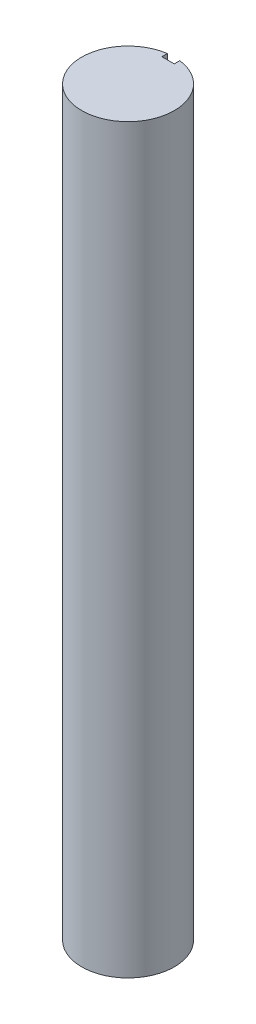
ISO-10303-21;
HEADER;
FILE_DESCRIPTION(('STEP AP214'),'2;1');
FILE_NAME('part.step','',(''),(''),'','','');
FILE_SCHEMA(('AUTOMOTIVE_DESIGN { 1 0 10303 214 1 1 1 1 }'));
ENDSEC;
DATA;
#1=APPLICATION_CONTEXT('core data for automotive mechanical design processes');
#2=APPLICATION_PROTOCOL_DEFINITION('international standard','automotive_design',2000,#1);
#3=PRODUCT_CONTEXT('',#1,'mechanical');
#4=PRODUCT('Part','Part','',(#3));
#5=PRODUCT_RELATED_PRODUCT_CATEGORY('part','',(#4));
#6=PRODUCT_DEFINITION_FORMATION('','',#4);
#7=PRODUCT_DEFINITION_CONTEXT('part definition',#1,'design');
#8=PRODUCT_DEFINITION('design','',#6,#7);
#9=PRODUCT_DEFINITION_SHAPE('','',#8);
#10=(LENGTH_UNIT() NAMED_UNIT(*) SI_UNIT(.MILLI.,.METRE.));
#11=(NAMED_UNIT(*) PLANE_ANGLE_UNIT() SI_UNIT($,.RADIAN.));
#12=(NAMED_UNIT(*) SI_UNIT($,.STERADIAN.) SOLID_ANGLE_UNIT());
#13=UNCERTAINTY_MEASURE_WITH_UNIT(LENGTH_MEASURE(1.E-05),#10,'distance_accuracy_value','');
#14=(GEOMETRIC_REPRESENTATION_CONTEXT(3) GLOBAL_UNCERTAINTY_ASSIGNED_CONTEXT((#13)) GLOBAL_UNIT_ASSIGNED_CONTEXT((#10,
#11,#12)) REPRESENTATION_CONTEXT('',''));
#15=CARTESIAN_POINT('',(0.,0.,0.));
#16=DIRECTION('',(0.,0.,1.));
#17=DIRECTION('',(1.,0.,0.));
#18=AXIS2_PLACEMENT_3D('',#15,#16,#17);
#19=CARTESIAN_POINT('',(0.,101.6,0.));
#20=DIRECTION('',(0.,-1.,0.));
#21=DIRECTION('',(0.,0.,-1.));
#22=AXIS2_PLACEMENT_3D('',#19,#20,#21);
#23=CYLINDRICAL_SURFACE('',#22,6.35);
#24=CARTESIAN_POINT('',(0.,0.,0.));
#25=DIRECTION('',(0.,1.,0.));
#26=DIRECTION('',(0.,0.,1.));
#27=AXIS2_PLACEMENT_3D('',#24,#25,#26);
#28=CIRCLE('',#27,6.35);
#29=CARTESIAN_POINT('',(-0.908611121536667,0.,-6.28465797238162));
#30=VERTEX_POINT('',#29);
#31=CARTESIAN_POINT('',(0.797392483591664,0.,-6.2997353299255));
#32=VERTEX_POINT('',#31);
#33=EDGE_CURVE('E96',#30,#32,#28,.T.);
#34=ORIENTED_EDGE('',*,*,#33,.T.);
#35=DIRECTION('',(0.,-1.,0.));
#36=VECTOR('',#35,1.);
#37=CARTESIAN_POINT('',(0.797392483591664,101.6,-6.2997353299255));
#38=LINE('',#37,#36);
#39=CARTESIAN_POINT('',(0.797392483591664,101.6,-6.2997353299255));
#40=VERTEX_POINT('',#39);
#41=EDGE_CURVE('E11',#40,#32,#38,.T.);
#42=ORIENTED_EDGE('',*,*,#41,.F.);
#43=CARTESIAN_POINT('',(0.,101.6,0.));
#44=DIRECTION('',(0.,1.,0.));
#45=DIRECTION('',(0.,0.,1.));
#46=AXIS2_PLACEMENT_3D('',#43,#44,#45);
#47=CIRCLE('',#46,6.35);
#48=CARTESIAN_POINT('',(-0.908611121536667,101.6,-6.28465797238162));
#49=VERTEX_POINT('',#48);
#50=EDGE_CURVE('E84',#49,#40,#47,.T.);
#51=ORIENTED_EDGE('',*,*,#50,.F.);
#52=DIRECTION('',(0.,-1.,0.));
#53=VECTOR('',#52,1.);
#54=CARTESIAN_POINT('',(-0.908611121536667,101.6,-6.28465797238162));
#55=LINE('',#54,#53);
#56=EDGE_CURVE('E92',#49,#30,#55,.T.);
#57=ORIENTED_EDGE('',*,*,#56,.T.);
#58=EDGE_LOOP('',(#34,#42,#51,#57));
#59=FACE_BOUND('',#58,.T.);
#60=ADVANCED_FACE('F33',(#59),#23,.T.);
#61=CARTESIAN_POINT('',(0.797392483591664,101.6,-6.2997353299255));
#62=DIRECTION('',(1.,0.,0.));
#63=DIRECTION('',(0.,0.,-1.));
#64=AXIS2_PLACEMENT_3D('',#61,#62,#63);
#65=PLANE('',#64);
#66=DIRECTION('',(0.,0.,1.));
#67=VECTOR('',#66,1.);
#68=CARTESIAN_POINT('',(0.797392483591664,0.,-6.2997353299255));
#69=LINE('',#68,#67);
#70=CARTESIAN_POINT('',(0.797392483591664,0.,-5.534751172856));
#71=VERTEX_POINT('',#70);
#72=EDGE_CURVE('E88',#32,#71,#69,.T.);
#73=ORIENTED_EDGE('',*,*,#72,.T.);
#74=DIRECTION('',(0.,-1.,0.));
#75=VECTOR('',#74,1.);
#76=CARTESIAN_POINT('',(0.797392483591664,101.6,-5.534751172856));
#77=LINE('',#76,#75);
#78=CARTESIAN_POINT('',(0.797392483591664,101.6,-5.534751172856));
#79=VERTEX_POINT('',#78);
#80=EDGE_CURVE('E41',#79,#71,#77,.T.);
#81=ORIENTED_EDGE('',*,*,#80,.F.);
#82=DIRECTION('',(0.,0.,1.));
#83=VECTOR('',#82,1.);
#84=CARTESIAN_POINT('',(0.797392483591664,101.6,-6.2997353299255));
#85=LINE('',#84,#83);
#86=EDGE_CURVE('E79',#40,#79,#85,.T.);
#87=ORIENTED_EDGE('',*,*,#86,.F.);
#88=ORIENTED_EDGE('',*,*,#41,.T.);
#89=EDGE_LOOP('',(#73,#81,#87,#88));
#90=FACE_BOUND('',#89,.T.);
#91=ADVANCED_FACE('F87',(#90),#65,.F.);
#92=CARTESIAN_POINT('',(-0.908611121536667,101.6,-5.534751172856));
#93=DIRECTION('',(0.,0.,1.));
#94=DIRECTION('',(1.,0.,0.));
#95=AXIS2_PLACEMENT_3D('',#92,#93,#94);
#96=PLANE('',#95);
#97=DIRECTION('',(-1.,0.,0.));
#98=VECTOR('',#97,1.);
#99=CARTESIAN_POINT('',(-0.908611121536667,0.,-5.534751172856));
#100=LINE('',#99,#98);
#101=CARTESIAN_POINT('',(-0.908611121536667,0.,-5.534751172856));
#102=VERTEX_POINT('',#101);
#103=EDGE_CURVE('E66',#71,#102,#100,.T.);
#104=ORIENTED_EDGE('',*,*,#103,.T.);
#105=DIRECTION('',(0.,-1.,0.));
#106=VECTOR('',#105,1.);
#107=CARTESIAN_POINT('',(-0.908611121536667,101.6,-5.534751172856));
#108=LINE('',#107,#106);
#109=CARTESIAN_POINT('',(-0.908611121536667,101.6,-5.534751172856));
#110=VERTEX_POINT('',#109);
#111=EDGE_CURVE('E89',#110,#102,#108,.T.);
#112=ORIENTED_EDGE('',*,*,#111,.F.);
#113=DIRECTION('',(-1.,0.,0.));
#114=VECTOR('',#113,1.);
#115=CARTESIAN_POINT('',(-0.908611121536667,101.6,-5.534751172856));
#116=LINE('',#115,#114);
#117=EDGE_CURVE('E82',#79,#110,#116,.T.);
#118=ORIENTED_EDGE('',*,*,#117,.F.);
#119=ORIENTED_EDGE('',*,*,#80,.T.);
#120=EDGE_LOOP('',(#104,#112,#118,#119));
#121=FACE_BOUND('',#120,.T.);
#122=ADVANCED_FACE('F90',(#121),#96,.F.);
#123=CARTESIAN_POINT('',(-0.908611121536667,101.6,-6.28465797238162));
#124=DIRECTION('',(-1.,0.,0.));
#125=DIRECTION('',(0.,0.,1.));
#126=AXIS2_PLACEMENT_3D('',#123,#124,#125);
#127=PLANE('',#126);
#128=DIRECTION('',(0.,0.,-1.));
#129=VECTOR('',#128,1.);
#130=CARTESIAN_POINT('',(-0.908611121536667,0.,-6.28465797238162));
#131=LINE('',#130,#129);
#132=EDGE_CURVE('E72',#102,#30,#131,.T.);
#133=ORIENTED_EDGE('',*,*,#132,.T.);
#134=ORIENTED_EDGE('',*,*,#56,.F.);
#135=DIRECTION('',(0.,0.,-1.));
#136=VECTOR('',#135,1.);
#137=CARTESIAN_POINT('',(-0.908611121536667,101.6,-6.28465797238162));
#138=LINE('',#137,#136);
#139=EDGE_CURVE('E49',#110,#49,#138,.T.);
#140=ORIENTED_EDGE('',*,*,#139,.F.);
#141=ORIENTED_EDGE('',*,*,#111,.T.);
#142=EDGE_LOOP('',(#133,#134,#140,#141));
#143=FACE_BOUND('',#142,.T.);
#144=ADVANCED_FACE('F103',(#143),#127,.F.);
#145=CARTESIAN_POINT('',(0.,101.6,0.));
#146=DIRECTION('',(0.,1.,0.));
#147=DIRECTION('',(0.,0.,1.));
#148=AXIS2_PLACEMENT_3D('',#145,#146,#147);
#149=PLANE('',#148);
#150=ORIENTED_EDGE('',*,*,#50,.T.);
#151=ORIENTED_EDGE('',*,*,#86,.T.);
#152=ORIENTED_EDGE('',*,*,#117,.T.);
#153=ORIENTED_EDGE('',*,*,#139,.T.);
#154=EDGE_LOOP('',(#150,#151,#152,#153));
#155=FACE_BOUND('',#154,.T.);
#156=ADVANCED_FACE('F80',(#155),#149,.T.);
#157=CARTESIAN_POINT('',(0.,0.,0.));
#158=DIRECTION('',(0.,1.,0.));
#159=DIRECTION('',(0.,0.,1.));
#160=AXIS2_PLACEMENT_3D('',#157,#158,#159);
#161=PLANE('',#160);
#162=ORIENTED_EDGE('',*,*,#33,.F.);
#163=ORIENTED_EDGE('',*,*,#132,.F.);
#164=ORIENTED_EDGE('',*,*,#103,.F.);
#165=ORIENTED_EDGE('',*,*,#72,.F.);
#166=EDGE_LOOP('',(#162,#163,#164,#165));
#167=FACE_BOUND('',#166,.T.);
#168=ADVANCED_FACE('F106',(#167),#161,.F.);
#169=CLOSED_SHELL('',(#60,#91,#122,#144,#156,#168));
#170=MANIFOLD_SOLID_BREP('B2',#169);
#171=ADVANCED_BREP_SHAPE_REPRESENTATION('',(#18,#170),#14);
#172=SHAPE_DEFINITION_REPRESENTATION(#9,#171);
ENDSEC;
END-ISO-10303-21;
